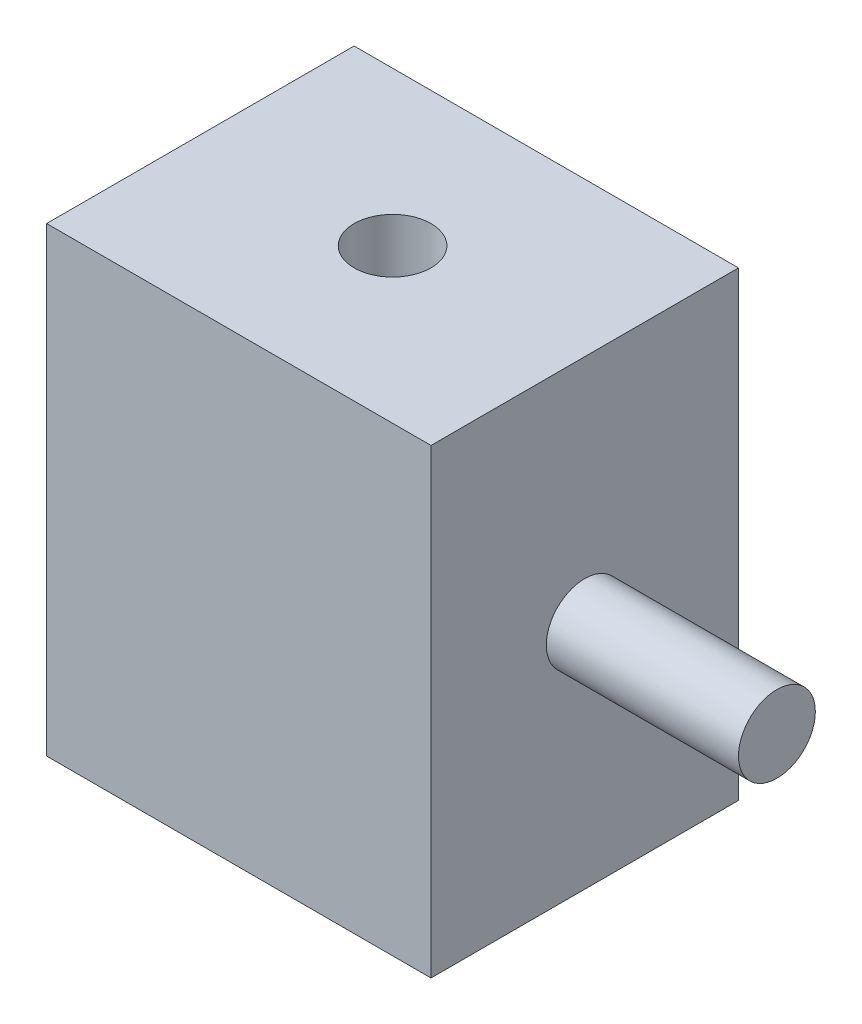
ISO-10303-21;
HEADER;
FILE_DESCRIPTION(('STEP AP214'),'2;1');
FILE_NAME('part.step','',(''),(''),'','','');
FILE_SCHEMA(('AUTOMOTIVE_DESIGN { 1 0 10303 214 1 1 1 1 }'));
ENDSEC;
DATA;
#1=APPLICATION_CONTEXT('core data for automotive mechanical design processes');
#2=APPLICATION_PROTOCOL_DEFINITION('international standard','automotive_design',2000,#1);
#3=PRODUCT_CONTEXT('',#1,'mechanical');
#4=PRODUCT('Part','Part','',(#3));
#5=PRODUCT_RELATED_PRODUCT_CATEGORY('part','',(#4));
#6=PRODUCT_DEFINITION_FORMATION('','',#4);
#7=PRODUCT_DEFINITION_CONTEXT('part definition',#1,'design');
#8=PRODUCT_DEFINITION('design','',#6,#7);
#9=PRODUCT_DEFINITION_SHAPE('','',#8);
#10=(LENGTH_UNIT() NAMED_UNIT(*) SI_UNIT(.MILLI.,.METRE.));
#11=(NAMED_UNIT(*) PLANE_ANGLE_UNIT() SI_UNIT($,.RADIAN.));
#12=(NAMED_UNIT(*) SI_UNIT($,.STERADIAN.) SOLID_ANGLE_UNIT());
#13=UNCERTAINTY_MEASURE_WITH_UNIT(LENGTH_MEASURE(1.E-05),#10,'distance_accuracy_value','');
#14=(GEOMETRIC_REPRESENTATION_CONTEXT(3) GLOBAL_UNCERTAINTY_ASSIGNED_CONTEXT((#13)) GLOBAL_UNIT_ASSIGNED_CONTEXT((#10,
#11,#12)) REPRESENTATION_CONTEXT('',''));
#15=CARTESIAN_POINT('',(0.,0.,0.));
#16=DIRECTION('',(0.,0.,1.));
#17=DIRECTION('',(1.,0.,0.));
#18=AXIS2_PLACEMENT_3D('',#15,#16,#17);
#19=CARTESIAN_POINT('',(5.,-6.,8.));
#20=DIRECTION('',(-1.,0.,0.));
#21=DIRECTION('',(0.,0.,1.));
#22=AXIS2_PLACEMENT_3D('',#19,#20,#21);
#23=PLANE('',#22);
#24=CARTESIAN_POINT('',(5.,0.,4.));
#25=DIRECTION('',(-1.,0.,0.));
#26=DIRECTION('',(0.,0.,1.));
#27=AXIS2_PLACEMENT_3D('',#24,#25,#26);
#28=CIRCLE('',#27,1.);
#29=CARTESIAN_POINT('',(5.,0.,5.));
#30=VERTEX_POINT('',#29);
#31=EDGE_CURVE('E11',#30,#30,#28,.F.);
#32=ORIENTED_EDGE('',*,*,#31,.F.);
#33=EDGE_LOOP('',(#32));
#34=FACE_BOUND('',#33,.T.);
#35=DIRECTION('',(0.,1.,0.));
#36=VECTOR('',#35,1.);
#37=CARTESIAN_POINT('',(5.,-6.,0.));
#38=LINE('',#37,#36);
#39=CARTESIAN_POINT('',(5.,-6.,0.));
#40=VERTEX_POINT('',#39);
#41=CARTESIAN_POINT('',(5.,6.,0.));
#42=VERTEX_POINT('',#41);
#43=EDGE_CURVE('E114',#40,#42,#38,.T.);
#44=ORIENTED_EDGE('',*,*,#43,.T.);
#45=DIRECTION('',(0.,0.,-1.));
#46=VECTOR('',#45,1.);
#47=CARTESIAN_POINT('',(5.,6.,8.));
#48=LINE('',#47,#46);
#49=CARTESIAN_POINT('',(5.,6.,8.));
#50=VERTEX_POINT('',#49);
#51=EDGE_CURVE('E52',#50,#42,#48,.T.);
#52=ORIENTED_EDGE('',*,*,#51,.F.);
#53=DIRECTION('',(0.,1.,0.));
#54=VECTOR('',#53,1.);
#55=CARTESIAN_POINT('',(5.,-6.,8.));
#56=LINE('',#55,#54);
#57=CARTESIAN_POINT('',(5.,-6.,8.));
#58=VERTEX_POINT('',#57);
#59=EDGE_CURVE('E96',#58,#50,#56,.T.);
#60=ORIENTED_EDGE('',*,*,#59,.F.);
#61=DIRECTION('',(0.,0.,-1.));
#62=VECTOR('',#61,1.);
#63=CARTESIAN_POINT('',(5.,-6.,8.));
#64=LINE('',#63,#62);
#65=EDGE_CURVE('E110',#58,#40,#64,.T.);
#66=ORIENTED_EDGE('',*,*,#65,.T.);
#67=EDGE_LOOP('',(#44,#52,#60,#66));
#68=FACE_BOUND('',#67,.T.);
#69=ADVANCED_FACE('F43',(#34,#68),#23,.F.);
#70=CARTESIAN_POINT('',(-5.,6.,8.));
#71=DIRECTION('',(0.,-1.,0.));
#72=DIRECTION('',(0.,0.,-1.));
#73=AXIS2_PLACEMENT_3D('',#70,#71,#72);
#74=PLANE('',#73);
#75=CARTESIAN_POINT('',(0.,6.,4.));
#76=DIRECTION('',(0.,-1.,0.));
#77=DIRECTION('',(0.,0.,-1.));
#78=AXIS2_PLACEMENT_3D('',#75,#76,#77);
#79=CIRCLE('',#78,1.);
#80=CARTESIAN_POINT('',(0.,6.,3.));
#81=VERTEX_POINT('',#80);
#82=EDGE_CURVE('E168',#81,#81,#79,.T.);
#83=ORIENTED_EDGE('',*,*,#82,.T.);
#84=EDGE_LOOP('',(#83));
#85=FACE_BOUND('',#84,.T.);
#86=DIRECTION('',(-1.,0.,0.));
#87=VECTOR('',#86,1.);
#88=CARTESIAN_POINT('',(-5.,6.,0.));
#89=LINE('',#88,#87);
#90=CARTESIAN_POINT('',(-5.,6.,0.));
#91=VERTEX_POINT('',#90);
#92=EDGE_CURVE('E102',#42,#91,#89,.T.);
#93=ORIENTED_EDGE('',*,*,#92,.T.);
#94=DIRECTION('',(0.,0.,-1.));
#95=VECTOR('',#94,1.);
#96=CARTESIAN_POINT('',(-5.,6.,8.));
#97=LINE('',#96,#95);
#98=CARTESIAN_POINT('',(-5.,6.,8.));
#99=VERTEX_POINT('',#98);
#100=EDGE_CURVE('E100',#99,#91,#97,.T.);
#101=ORIENTED_EDGE('',*,*,#100,.F.);
#102=DIRECTION('',(-1.,0.,0.));
#103=VECTOR('',#102,1.);
#104=CARTESIAN_POINT('',(-5.,6.,8.));
#105=LINE('',#104,#103);
#106=EDGE_CURVE('E91',#50,#99,#105,.T.);
#107=ORIENTED_EDGE('',*,*,#106,.F.);
#108=ORIENTED_EDGE('',*,*,#51,.T.);
#109=EDGE_LOOP('',(#93,#101,#107,#108));
#110=FACE_BOUND('',#109,.T.);
#111=ADVANCED_FACE('F101',(#85,#110),#74,.F.);
#112=CARTESIAN_POINT('',(-5.,-6.,8.));
#113=DIRECTION('',(1.,0.,0.));
#114=DIRECTION('',(0.,0.,-1.));
#115=AXIS2_PLACEMENT_3D('',#112,#113,#114);
#116=PLANE('',#115);
#117=DIRECTION('',(0.,-1.,0.));
#118=VECTOR('',#117,1.);
#119=CARTESIAN_POINT('',(-5.,-6.,0.));
#120=LINE('',#119,#118);
#121=CARTESIAN_POINT('',(-5.,-6.,0.));
#122=VERTEX_POINT('',#121);
#123=EDGE_CURVE('E77',#91,#122,#120,.T.);
#124=ORIENTED_EDGE('',*,*,#123,.T.);
#125=DIRECTION('',(0.,0.,-1.));
#126=VECTOR('',#125,1.);
#127=CARTESIAN_POINT('',(-5.,-6.,8.));
#128=LINE('',#127,#126);
#129=CARTESIAN_POINT('',(-5.,-6.,8.));
#130=VERTEX_POINT('',#129);
#131=EDGE_CURVE('E104',#130,#122,#128,.T.);
#132=ORIENTED_EDGE('',*,*,#131,.F.);
#133=DIRECTION('',(0.,-1.,0.));
#134=VECTOR('',#133,1.);
#135=CARTESIAN_POINT('',(-5.,-6.,8.));
#136=LINE('',#135,#134);
#137=EDGE_CURVE('E94',#99,#130,#136,.T.);
#138=ORIENTED_EDGE('',*,*,#137,.F.);
#139=ORIENTED_EDGE('',*,*,#100,.T.);
#140=EDGE_LOOP('',(#124,#132,#138,#139));
#141=FACE_BOUND('',#140,.T.);
#142=ADVANCED_FACE('F106',(#141),#116,.F.);
#143=CARTESIAN_POINT('',(-5.,-6.,8.));
#144=DIRECTION('',(0.,1.,0.));
#145=DIRECTION('',(0.,0.,1.));
#146=AXIS2_PLACEMENT_3D('',#143,#144,#145);
#147=PLANE('',#146);
#148=CARTESIAN_POINT('',(0.,-6.,4.));
#149=DIRECTION('',(0.,-1.,0.));
#150=DIRECTION('',(0.,0.,-1.));
#151=AXIS2_PLACEMENT_3D('',#148,#149,#150);
#152=CIRCLE('',#151,1.);
#153=CARTESIAN_POINT('',(0.,-6.,3.));
#154=VERTEX_POINT('',#153);
#155=EDGE_CURVE('E165',#154,#154,#152,.T.);
#156=ORIENTED_EDGE('',*,*,#155,.F.);
#157=EDGE_LOOP('',(#156));
#158=FACE_BOUND('',#157,.T.);
#159=DIRECTION('',(1.,0.,0.));
#160=VECTOR('',#159,1.);
#161=CARTESIAN_POINT('',(-5.,-6.,0.));
#162=LINE('',#161,#160);
#163=EDGE_CURVE('E83',#122,#40,#162,.T.);
#164=ORIENTED_EDGE('',*,*,#163,.T.);
#165=ORIENTED_EDGE('',*,*,#65,.F.);
#166=DIRECTION('',(1.,0.,0.));
#167=VECTOR('',#166,1.);
#168=CARTESIAN_POINT('',(-5.,-6.,8.));
#169=LINE('',#168,#167);
#170=EDGE_CURVE('E60',#130,#58,#169,.T.);
#171=ORIENTED_EDGE('',*,*,#170,.F.);
#172=ORIENTED_EDGE('',*,*,#131,.T.);
#173=EDGE_LOOP('',(#164,#165,#171,#172));
#174=FACE_BOUND('',#173,.T.);
#175=ADVANCED_FACE('F143',(#158,#174),#147,.F.);
#176=CARTESIAN_POINT('',(0.,0.,8.));
#177=DIRECTION('',(0.,0.,-1.));
#178=DIRECTION('',(-1.,0.,0.));
#179=AXIS2_PLACEMENT_3D('',#176,#177,#178);
#180=PLANE('',#179);
#181=ORIENTED_EDGE('',*,*,#59,.T.);
#182=ORIENTED_EDGE('',*,*,#106,.T.);
#183=ORIENTED_EDGE('',*,*,#137,.T.);
#184=ORIENTED_EDGE('',*,*,#170,.T.);
#185=EDGE_LOOP('',(#181,#182,#183,#184));
#186=FACE_BOUND('',#185,.T.);
#187=ADVANCED_FACE('F92',(#186),#180,.F.);
#188=CARTESIAN_POINT('',(0.,0.,0.));
#189=DIRECTION('',(0.,0.,-1.));
#190=DIRECTION('',(-1.,0.,0.));
#191=AXIS2_PLACEMENT_3D('',#188,#189,#190);
#192=PLANE('',#191);
#193=ORIENTED_EDGE('',*,*,#43,.F.);
#194=ORIENTED_EDGE('',*,*,#163,.F.);
#195=ORIENTED_EDGE('',*,*,#123,.F.);
#196=ORIENTED_EDGE('',*,*,#92,.F.);
#197=EDGE_LOOP('',(#193,#194,#195,#196));
#198=FACE_BOUND('',#197,.T.);
#199=ADVANCED_FACE('F132',(#198),#192,.T.);
#200=CARTESIAN_POINT('',(10.,0.,4.));
#201=DIRECTION('',(-1.,0.,0.));
#202=DIRECTION('',(0.,0.,1.));
#203=AXIS2_PLACEMENT_3D('',#200,#201,#202);
#204=CYLINDRICAL_SURFACE('',#203,1.);
#205=CARTESIAN_POINT('',(10.,0.,4.));
#206=DIRECTION('',(1.,0.,0.));
#207=DIRECTION('',(0.,0.,-1.));
#208=AXIS2_PLACEMENT_3D('',#205,#206,#207);
#209=CIRCLE('',#208,1.);
#210=CARTESIAN_POINT('',(10.,0.,3.));
#211=VERTEX_POINT('',#210);
#212=EDGE_CURVE('E118',#211,#211,#209,.T.);
#213=ORIENTED_EDGE('',*,*,#212,.F.);
#214=EDGE_LOOP('',(#213));
#215=FACE_BOUND('',#214,.T.);
#216=ORIENTED_EDGE('',*,*,#31,.T.);
#217=EDGE_LOOP('',(#216));
#218=FACE_BOUND('',#217,.T.);
#219=ADVANCED_FACE('F134',(#215,#218),#204,.T.);
#220=CARTESIAN_POINT('',(10.,0.,4.));
#221=DIRECTION('',(1.,0.,0.));
#222=DIRECTION('',(0.,0.,-1.));
#223=AXIS2_PLACEMENT_3D('',#220,#221,#222);
#224=PLANE('',#223);
#225=ORIENTED_EDGE('',*,*,#212,.T.);
#226=EDGE_LOOP('',(#225));
#227=FACE_BOUND('',#226,.T.);
#228=ADVANCED_FACE('F140',(#227),#224,.T.);
#229=CARTESIAN_POINT('',(0.,10.,4.));
#230=DIRECTION('',(0.,-1.,0.));
#231=DIRECTION('',(0.,0.,-1.));
#232=AXIS2_PLACEMENT_3D('',#229,#230,#231);
#233=CYLINDRICAL_SURFACE('',#232,1.);
#234=ORIENTED_EDGE('',*,*,#155,.T.);
#235=EDGE_LOOP('',(#234));
#236=FACE_BOUND('',#235,.T.);
#237=ORIENTED_EDGE('',*,*,#82,.F.);
#238=EDGE_LOOP('',(#237));
#239=FACE_BOUND('',#238,.T.);
#240=ADVANCED_FACE('F179',(#236,#239),#233,.F.);
#241=CLOSED_SHELL('',(#69,#111,#142,#175,#187,#199,#219,#228,#240));
#242=MANIFOLD_SOLID_BREP('B2',#241);
#243=ADVANCED_BREP_SHAPE_REPRESENTATION('',(#18,#242),#14);
#244=SHAPE_DEFINITION_REPRESENTATION(#9,#243);
ENDSEC;
END-ISO-10303-21;
